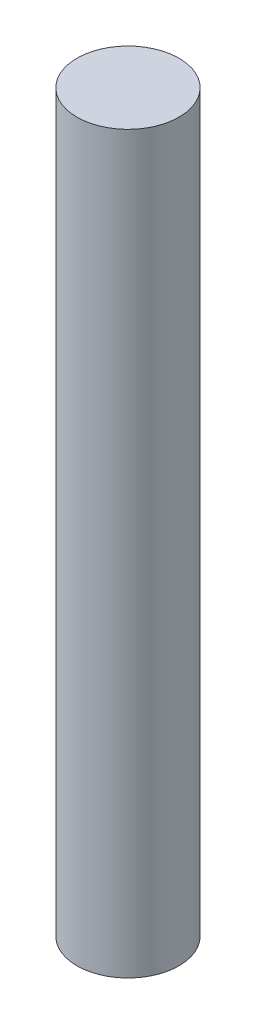
ISO-10303-21;
HEADER;
FILE_DESCRIPTION(('STEP AP214'),'2;1');
FILE_NAME('part.step','',(''),(''),'','','');
FILE_SCHEMA(('AUTOMOTIVE_DESIGN { 1 0 10303 214 1 1 1 1 }'));
ENDSEC;
DATA;
#1=APPLICATION_CONTEXT('core data for automotive mechanical design processes');
#2=APPLICATION_PROTOCOL_DEFINITION('international standard','automotive_design',2000,#1);
#3=PRODUCT_CONTEXT('',#1,'mechanical');
#4=PRODUCT('Part','Part','',(#3));
#5=PRODUCT_RELATED_PRODUCT_CATEGORY('part','',(#4));
#6=PRODUCT_DEFINITION_FORMATION('','',#4);
#7=PRODUCT_DEFINITION_CONTEXT('part definition',#1,'design');
#8=PRODUCT_DEFINITION('design','',#6,#7);
#9=PRODUCT_DEFINITION_SHAPE('','',#8);
#10=(LENGTH_UNIT() NAMED_UNIT(*) SI_UNIT(.MILLI.,.METRE.));
#11=(NAMED_UNIT(*) PLANE_ANGLE_UNIT() SI_UNIT($,.RADIAN.));
#12=(NAMED_UNIT(*) SI_UNIT($,.STERADIAN.) SOLID_ANGLE_UNIT());
#13=UNCERTAINTY_MEASURE_WITH_UNIT(LENGTH_MEASURE(1.E-05),#10,'distance_accuracy_value','');
#14=(GEOMETRIC_REPRESENTATION_CONTEXT(3) GLOBAL_UNCERTAINTY_ASSIGNED_CONTEXT((#13)) GLOBAL_UNIT_ASSIGNED_CONTEXT((#10,
#11,#12)) REPRESENTATION_CONTEXT('',''));
#15=CARTESIAN_POINT('',(0.,0.,0.));
#16=DIRECTION('',(0.,0.,1.));
#17=DIRECTION('',(1.,0.,0.));
#18=AXIS2_PLACEMENT_3D('',#15,#16,#17);
#19=CARTESIAN_POINT('',(0.,36.,0.));
#20=DIRECTION('',(0.,-1.,0.));
#21=DIRECTION('',(0.,0.,-1.));
#22=AXIS2_PLACEMENT_3D('',#19,#20,#21);
#23=CYLINDRICAL_SURFACE('',#22,2.5);
#24=CARTESIAN_POINT('',(0.,36.,0.));
#25=DIRECTION('',(0.,1.,0.));
#26=DIRECTION('',(0.,0.,1.));
#27=AXIS2_PLACEMENT_3D('',#24,#25,#26);
#28=CIRCLE('',#27,2.5);
#29=CARTESIAN_POINT('',(0.,36.,2.5));
#30=VERTEX_POINT('',#29);
#31=EDGE_CURVE('E10',#30,#30,#28,.T.);
#32=ORIENTED_EDGE('',*,*,#31,.F.);
#33=EDGE_LOOP('',(#32));
#34=FACE_BOUND('',#33,.T.);
#35=CARTESIAN_POINT('',(0.,0.,0.));
#36=DIRECTION('',(0.,1.,0.));
#37=DIRECTION('',(0.,0.,1.));
#38=AXIS2_PLACEMENT_3D('',#35,#36,#37);
#39=CIRCLE('',#38,2.5);
#40=CARTESIAN_POINT('',(0.,0.,2.5));
#41=VERTEX_POINT('',#40);
#42=EDGE_CURVE('E36',#41,#41,#39,.T.);
#43=ORIENTED_EDGE('',*,*,#42,.T.);
#44=EDGE_LOOP('',(#43));
#45=FACE_BOUND('',#44,.T.);
#46=ADVANCED_FACE('F34',(#34,#45),#23,.T.);
#47=CARTESIAN_POINT('',(0.,36.,0.));
#48=DIRECTION('',(0.,1.,0.));
#49=DIRECTION('',(0.,0.,1.));
#50=AXIS2_PLACEMENT_3D('',#47,#48,#49);
#51=PLANE('',#50);
#52=ORIENTED_EDGE('',*,*,#31,.T.);
#53=EDGE_LOOP('',(#52));
#54=FACE_BOUND('',#53,.T.);
#55=ADVANCED_FACE('F49',(#54),#51,.T.);
#56=CARTESIAN_POINT('',(0.,0.,0.));
#57=DIRECTION('',(0.,1.,0.));
#58=DIRECTION('',(0.,0.,1.));
#59=AXIS2_PLACEMENT_3D('',#56,#57,#58);
#60=PLANE('',#59);
#61=ORIENTED_EDGE('',*,*,#42,.F.);
#62=EDGE_LOOP('',(#61));
#63=FACE_BOUND('',#62,.T.);
#64=ADVANCED_FACE('F48',(#63),#60,.F.);
#65=CLOSED_SHELL('',(#46,#55,#64));
#66=MANIFOLD_SOLID_BREP('B2',#65);
#67=ADVANCED_BREP_SHAPE_REPRESENTATION('',(#18,#66),#14);
#68=SHAPE_DEFINITION_REPRESENTATION(#9,#67);
ENDSEC;
END-ISO-10303-21;
